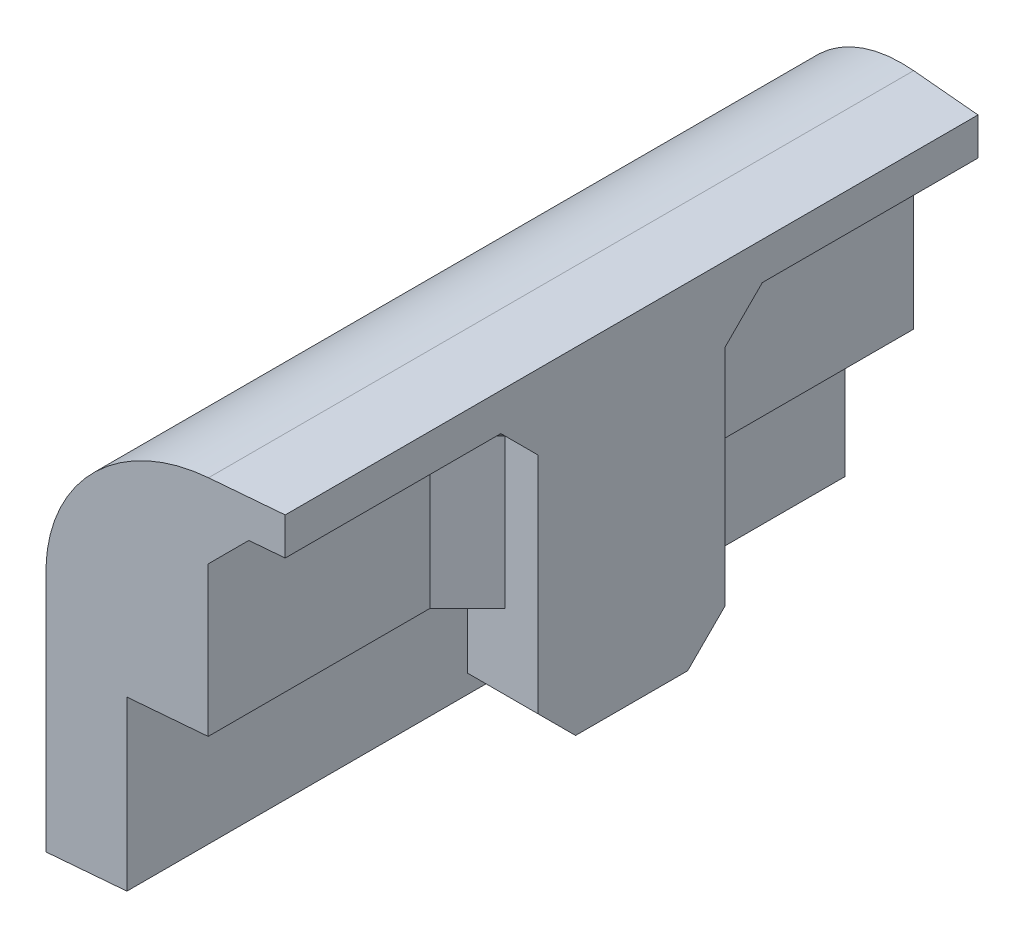
ISO-10303-21;
HEADER;
FILE_DESCRIPTION(('STEP AP214'),'2;1');
FILE_NAME('part.step','',(''),(''),'','','');
FILE_SCHEMA(('AUTOMOTIVE_DESIGN { 1 0 10303 214 1 1 1 1 }'));
ENDSEC;
DATA;
#1=APPLICATION_CONTEXT('core data for automotive mechanical design processes');
#2=APPLICATION_PROTOCOL_DEFINITION('international standard','automotive_design',2000,#1);
#3=PRODUCT_CONTEXT('',#1,'mechanical');
#4=PRODUCT('Part','Part','',(#3));
#5=PRODUCT_RELATED_PRODUCT_CATEGORY('part','',(#4));
#6=PRODUCT_DEFINITION_FORMATION('','',#4);
#7=PRODUCT_DEFINITION_CONTEXT('part definition',#1,'design');
#8=PRODUCT_DEFINITION('design','',#6,#7);
#9=PRODUCT_DEFINITION_SHAPE('','',#8);
#10=(LENGTH_UNIT() NAMED_UNIT(*) SI_UNIT(.MILLI.,.METRE.));
#11=(NAMED_UNIT(*) PLANE_ANGLE_UNIT() SI_UNIT($,.RADIAN.));
#12=(NAMED_UNIT(*) SI_UNIT($,.STERADIAN.) SOLID_ANGLE_UNIT());
#13=UNCERTAINTY_MEASURE_WITH_UNIT(LENGTH_MEASURE(1.E-05),#10,'distance_accuracy_value','');
#14=(GEOMETRIC_REPRESENTATION_CONTEXT(3) GLOBAL_UNCERTAINTY_ASSIGNED_CONTEXT((#13)) GLOBAL_UNIT_ASSIGNED_CONTEXT((#10,
#11,#12)) REPRESENTATION_CONTEXT('',''));
#15=CARTESIAN_POINT('',(0.,0.,0.));
#16=DIRECTION('',(0.,0.,1.));
#17=DIRECTION('',(1.,0.,0.));
#18=AXIS2_PLACEMENT_3D('',#15,#16,#17);
#19=CARTESIAN_POINT('',(-301.612263913905,87.8585951480168,-137.105018087838));
#20=DIRECTION('',(0.,-1.,0.));
#21=DIRECTION('',(0.,0.,-1.));
#22=AXIS2_PLACEMENT_3D('',#19,#20,#21);
#23=PLANE('',#22);
#24=DIRECTION('',(0.,0.,-1.));
#25=VECTOR('',#24,1.);
#26=CARTESIAN_POINT('',(-295.262263913905,87.8585951480168,15.875));
#27=LINE('',#26,#25);
#28=CARTESIAN_POINT('',(-295.262263913905,87.8585951480168,59.3791114816161));
#29=VERTEX_POINT('',#28);
#30=CARTESIAN_POINT('',(-295.262263913905,87.8585951480168,22.225));
#31=VERTEX_POINT('',#30);
#32=EDGE_CURVE('E283',#29,#31,#27,.T.);
#33=ORIENTED_EDGE('',*,*,#32,.T.);
#34=DIRECTION('',(1.,0.,0.));
#35=VECTOR('',#34,1.);
#36=CARTESIAN_POINT('',(-301.612263913905,87.8585951480168,22.225));
#37=LINE('',#36,#35);
#38=CARTESIAN_POINT('',(-289.576764759634,87.8585951480168,22.225));
#39=VERTEX_POINT('',#38);
#40=EDGE_CURVE('E285',#31,#39,#37,.T.);
#41=ORIENTED_EDGE('',*,*,#40,.T.);
#42=DIRECTION('',(0.,0.,1.));
#43=VECTOR('',#42,1.);
#44=CARTESIAN_POINT('',(-289.576764759634,87.8585951480168,-137.105018087838));
#45=LINE('',#44,#43);
#46=CARTESIAN_POINT('',(-289.576764759634,87.8585951480168,58.8816947591312));
#47=VERTEX_POINT('',#46);
#48=EDGE_CURVE('E242',#39,#47,#45,.T.);
#49=ORIENTED_EDGE('',*,*,#48,.T.);
#50=DIRECTION('',(-0.996194698091746,0.,0.0871557427476582));
#51=VECTOR('',#50,1.);
#52=CARTESIAN_POINT('',(-308.312509549559,87.8585951480168,60.5208600309645));
#53=LINE('',#52,#51);
#54=EDGE_CURVE('E234',#47,#29,#53,.T.);
#55=ORIENTED_EDGE('',*,*,#54,.T.);
#56=EDGE_LOOP('',(#33,#41,#49,#55));
#57=FACE_BOUND('',#56,.T.);
#58=ADVANCED_FACE('F35',(#57),#23,.T.);
#59=CARTESIAN_POINT('',(-289.576764759634,87.8585951480168,-58.8816947591312));
#60=VERTEX_POINT('',#59);
#61=CARTESIAN_POINT('',(-289.576764759634,87.8585951480168,-22.225));
#62=VERTEX_POINT('',#61);
#63=EDGE_CURVE('E238',#60,#62,#45,.T.);
#64=ORIENTED_EDGE('',*,*,#63,.T.);
#65=DIRECTION('',(-1.,0.,0.));
#66=VECTOR('',#65,1.);
#67=CARTESIAN_POINT('',(-301.612263913905,87.8585951480168,-22.225));
#68=LINE('',#67,#66);
#69=CARTESIAN_POINT('',(-295.262263913905,87.8585951480168,-22.225));
#70=VERTEX_POINT('',#69);
#71=EDGE_CURVE('E293',#62,#70,#68,.T.);
#72=ORIENTED_EDGE('',*,*,#71,.T.);
#73=DIRECTION('',(0.,0.,-1.));
#74=VECTOR('',#73,1.);
#75=CARTESIAN_POINT('',(-295.262263913905,87.8585951480168,-59.9346644950057));
#76=LINE('',#75,#74);
#77=CARTESIAN_POINT('',(-295.262263913905,87.8585951480168,-59.3791114816161));
#78=VERTEX_POINT('',#77);
#79=EDGE_CURVE('E291',#70,#78,#76,.T.);
#80=ORIENTED_EDGE('',*,*,#79,.T.);
#81=DIRECTION('',(-0.996194698091746,0.,-0.0871557427476582));
#82=VECTOR('',#81,1.);
#83=CARTESIAN_POINT('',(-308.312509549559,87.8585951480168,-60.5208600309645));
#84=LINE('',#83,#82);
#85=EDGE_CURVE('E270',#60,#78,#84,.T.);
#86=ORIENTED_EDGE('',*,*,#85,.F.);
#87=EDGE_LOOP('',(#64,#72,#80,#86));
#88=FACE_BOUND('',#87,.T.);
#89=ADVANCED_FACE('F355',(#88),#23,.T.);
#90=CARTESIAN_POINT('',(-301.612263913905,56.1085951480168,-137.105018087838));
#91=DIRECTION('',(1.,0.,0.));
#92=DIRECTION('',(0.,0.,-1.));
#93=AXIS2_PLACEMENT_3D('',#90,#91,#92);
#94=PLANE('',#93);
#95=DIRECTION('',(0.,1.,0.));
#96=VECTOR('',#95,1.);
#97=CARTESIAN_POINT('',(-301.612263913905,56.1085951480168,22.225));
#98=LINE('',#97,#96);
#99=CARTESIAN_POINT('',(-301.612263913905,56.1085951480168,22.225));
#100=VERTEX_POINT('',#99);
#101=CARTESIAN_POINT('',(-301.612263913905,81.5085951480168,22.225));
#102=VERTEX_POINT('',#101);
#103=EDGE_CURVE('E287',#100,#102,#98,.T.);
#104=ORIENTED_EDGE('',*,*,#103,.T.);
#105=DIRECTION('',(0.,0.,1.));
#106=VECTOR('',#105,1.);
#107=CARTESIAN_POINT('',(-301.612263913905,81.5085951480168,59.9346644950057));
#108=LINE('',#107,#106);
#109=CARTESIAN_POINT('',(-301.612263913905,81.5085951480168,59.9346644950057));
#110=VERTEX_POINT('',#109);
#111=EDGE_CURVE('E289',#102,#110,#108,.T.);
#112=ORIENTED_EDGE('',*,*,#111,.T.);
#113=DIRECTION('',(0.,-1.,0.));
#114=VECTOR('',#113,1.);
#115=CARTESIAN_POINT('',(-301.612263913905,56.1085951480168,59.9346644950057));
#116=LINE('',#115,#114);
#117=CARTESIAN_POINT('',(-301.612263913905,56.1085951480168,59.9346644950057));
#118=VERTEX_POINT('',#117);
#119=EDGE_CURVE('E232',#110,#118,#116,.T.);
#120=ORIENTED_EDGE('',*,*,#119,.T.);
#121=DIRECTION('',(0.,0.,1.));
#122=VECTOR('',#121,1.);
#123=CARTESIAN_POINT('',(-301.612263913905,56.1085951480168,-137.105018087838));
#124=LINE('',#123,#122);
#125=EDGE_CURVE('E247',#100,#118,#124,.T.);
#126=ORIENTED_EDGE('',*,*,#125,.F.);
#127=EDGE_LOOP('',(#104,#112,#120,#126));
#128=FACE_BOUND('',#127,.T.);
#129=ADVANCED_FACE('F408',(#128),#94,.T.);
#130=DIRECTION('',(0.,0.,1.));
#131=VECTOR('',#130,1.);
#132=CARTESIAN_POINT('',(-301.612263913905,81.5085951480167,-15.875));
#133=LINE('',#132,#131);
#134=CARTESIAN_POINT('',(-301.612263913905,81.5085951480167,-59.9346644950057));
#135=VERTEX_POINT('',#134);
#136=CARTESIAN_POINT('',(-301.612263913905,81.5085951480167,-22.2250000000001));
#137=VERTEX_POINT('',#136);
#138=EDGE_CURVE('E304',#135,#137,#133,.T.);
#139=ORIENTED_EDGE('',*,*,#138,.T.);
#140=DIRECTION('',(0.,-1.,0.));
#141=VECTOR('',#140,1.);
#142=CARTESIAN_POINT('',(-301.612263913905,56.1085951480168,-22.2250000000001));
#143=LINE('',#142,#141);
#144=CARTESIAN_POINT('',(-301.612263913905,56.1085951480168,-22.2250000000001));
#145=VERTEX_POINT('',#144);
#146=EDGE_CURVE('E306',#137,#145,#143,.T.);
#147=ORIENTED_EDGE('',*,*,#146,.T.);
#148=CARTESIAN_POINT('',(-301.612263913905,56.1085951480168,-59.9346644950057));
#149=VERTEX_POINT('',#148);
#150=EDGE_CURVE('E243',#149,#145,#124,.T.);
#151=ORIENTED_EDGE('',*,*,#150,.F.);
#152=DIRECTION('',(0.,-1.,0.));
#153=VECTOR('',#152,1.);
#154=CARTESIAN_POINT('',(-301.612263913905,56.1085951480168,-59.9346644950057));
#155=LINE('',#154,#153);
#156=EDGE_CURVE('E268',#135,#149,#155,.T.);
#157=ORIENTED_EDGE('',*,*,#156,.F.);
#158=EDGE_LOOP('',(#139,#147,#151,#157));
#159=FACE_BOUND('',#158,.T.);
#160=ADVANCED_FACE('F415',(#159),#94,.T.);
#161=CARTESIAN_POINT('',(-289.576764759634,87.8585951480168,-137.105018087838));
#162=DIRECTION('',(1.,0.,0.));
#163=DIRECTION('',(0.,0.,-1.));
#164=AXIS2_PLACEMENT_3D('',#161,#162,#163);
#165=PLANE('',#164);
#166=DIRECTION('',(0.,0.,-1.));
#167=VECTOR('',#166,1.);
#168=CARTESIAN_POINT('',(-289.576764759634,37.058595148016,-15.875));
#169=LINE('',#168,#167);
#170=CARTESIAN_POINT('',(-289.576764759634,37.058595148016,9.525));
#171=VERTEX_POINT('',#170);
#172=CARTESIAN_POINT('',(-289.576764759634,37.058595148016,-9.52499999999995));
#173=VERTEX_POINT('',#172);
#174=EDGE_CURVE('E220',#171,#173,#169,.T.);
#175=ORIENTED_EDGE('',*,*,#174,.T.);
#176=DIRECTION('',(0.,-0.707106781186546,0.707106781186549));
#177=VECTOR('',#176,1.);
#178=CARTESIAN_POINT('',(-289.576764759634,126.248604191935,-98.7150090439198));
#179=LINE('',#178,#177);
#180=CARTESIAN_POINT('',(-289.576764759634,43.408595148016,-15.875));
#181=VERTEX_POINT('',#180);
#182=EDGE_CURVE('E318',#173,#181,#179,.F.);
#183=ORIENTED_EDGE('',*,*,#182,.T.);
#184=DIRECTION('',(0.,1.,0.));
#185=VECTOR('',#184,1.);
#186=CARTESIAN_POINT('',(-289.576764759634,37.058595148016,-15.875));
#187=LINE('',#186,#185);
#188=CARTESIAN_POINT('',(-289.576764759634,81.5085951480167,-15.875));
#189=VERTEX_POINT('',#188);
#190=EDGE_CURVE('E215',#181,#189,#187,.T.);
#191=ORIENTED_EDGE('',*,*,#190,.T.);
#192=DIRECTION('',(0.,0.707106781186551,-0.707106781186544));
#193=VECTOR('',#192,1.);
#194=CARTESIAN_POINT('',(-289.576764759634,87.8585951480168,-22.225));
#195=LINE('',#194,#193);
#196=EDGE_CURVE('E326',#189,#62,#195,.T.);
#197=ORIENTED_EDGE('',*,*,#196,.T.);
#198=ORIENTED_EDGE('',*,*,#63,.F.);
#199=DIRECTION('',(0.,-1.,0.));
#200=VECTOR('',#199,1.);
#201=CARTESIAN_POINT('',(-289.576764759634,87.8585951480168,-58.8816947591312));
#202=LINE('',#201,#200);
#203=CARTESIAN_POINT('',(-289.576764759634,94.2085951480168,-58.8816947591312));
#204=VERTEX_POINT('',#203);
#205=EDGE_CURVE('E258',#204,#60,#202,.T.);
#206=ORIENTED_EDGE('',*,*,#205,.F.);
#207=DIRECTION('',(0.,0.,1.));
#208=VECTOR('',#207,1.);
#209=CARTESIAN_POINT('',(-289.576764759634,94.2085951480168,-137.105018087838));
#210=LINE('',#209,#208);
#211=CARTESIAN_POINT('',(-289.576764759634,94.2085951480168,58.8816947591312));
#212=VERTEX_POINT('',#211);
#213=EDGE_CURVE('E200',#204,#212,#210,.T.);
#214=ORIENTED_EDGE('',*,*,#213,.T.);
#215=DIRECTION('',(0.,-1.,0.));
#216=VECTOR('',#215,1.);
#217=CARTESIAN_POINT('',(-289.576764759634,87.8585951480168,58.8816947591312));
#218=LINE('',#217,#216);
#219=EDGE_CURVE('E210',#212,#47,#218,.T.);
#220=ORIENTED_EDGE('',*,*,#219,.T.);
#221=ORIENTED_EDGE('',*,*,#48,.F.);
#222=DIRECTION('',(0.,-0.707106781186549,-0.707106781186546));
#223=VECTOR('',#222,1.);
#224=CARTESIAN_POINT('',(-289.576764759634,81.5085951480168,15.875));
#225=LINE('',#224,#223);
#226=CARTESIAN_POINT('',(-289.576764759634,81.5085951480168,15.875));
#227=VERTEX_POINT('',#226);
#228=EDGE_CURVE('E320',#39,#227,#225,.T.);
#229=ORIENTED_EDGE('',*,*,#228,.T.);
#230=DIRECTION('',(0.,-1.,0.));
#231=VECTOR('',#230,1.);
#232=CARTESIAN_POINT('',(-289.576764759634,37.058595148016,15.875));
#233=LINE('',#232,#231);
#234=CARTESIAN_POINT('',(-289.576764759634,43.408595148016,15.875));
#235=VERTEX_POINT('',#234);
#236=EDGE_CURVE('E378',#227,#235,#233,.T.);
#237=ORIENTED_EDGE('',*,*,#236,.T.);
#238=DIRECTION('',(0.,0.707106781186549,0.707106781186546));
#239=VECTOR('',#238,1.);
#240=CARTESIAN_POINT('',(-289.576764759634,-10.8564138959027,-38.3900090439184));
#241=LINE('',#240,#239);
#242=EDGE_CURVE('E316',#235,#171,#241,.F.);
#243=ORIENTED_EDGE('',*,*,#242,.T.);
#244=EDGE_LOOP('',(#175,#183,#191,#197,#198,#206,#214,#220,#221,#229,#237,#243));
#245=FACE_BOUND('',#244,.T.);
#246=ADVANCED_FACE('F367',(#245),#165,.T.);
#247=CARTESIAN_POINT('',(-314.312263913905,56.1085951480168,-137.105018087838));
#248=DIRECTION('',(0.,-1.,0.));
#249=DIRECTION('',(1.,0.,0.));
#250=AXIS2_PLACEMENT_3D('',#247,#248,#249);
#251=PLANE('',#250);
#252=DIRECTION('',(-0.996194698091746,0.,-0.0871557427476582));
#253=VECTOR('',#252,1.);
#254=CARTESIAN_POINT('',(-320.916038781187,56.1085951480168,-61.6235259591495));
#255=LINE('',#254,#253);
#256=CARTESIAN_POINT('',(-314.312263913905,56.1085951480168,-61.045770521785));
#257=VERTEX_POINT('',#256);
#258=EDGE_CURVE('E266',#149,#257,#255,.T.);
#259=ORIENTED_EDGE('',*,*,#258,.F.);
#260=ORIENTED_EDGE('',*,*,#150,.T.);
#261=DIRECTION('',(0.707106781186545,0.,0.70710678118655));
#262=VECTOR('',#261,1.);
#263=CARTESIAN_POINT('',(-295.262263913905,56.1085951480168,-15.875));
#264=LINE('',#263,#262);
#265=CARTESIAN_POINT('',(-295.262263913905,56.1085951480168,-15.875));
#266=VERTEX_POINT('',#265);
#267=EDGE_CURVE('E44',#145,#266,#264,.T.);
#268=ORIENTED_EDGE('',*,*,#267,.T.);
#269=DIRECTION('',(1.,0.,0.));
#270=VECTOR('',#269,1.);
#271=CARTESIAN_POINT('',(-229.670984571074,56.1085951480169,-15.875));
#272=LINE('',#271,#270);
#273=CARTESIAN_POINT('',(-301.612263913905,56.1085951480168,-15.875));
#274=VERTEX_POINT('',#273);
#275=EDGE_CURVE('E52',#274,#266,#272,.T.);
#276=ORIENTED_EDGE('',*,*,#275,.F.);
#277=CARTESIAN_POINT('',(-301.612263913905,56.1085951480168,15.875));
#278=VERTEX_POINT('',#277);
#279=EDGE_CURVE('E246',#274,#278,#124,.T.);
#280=ORIENTED_EDGE('',*,*,#279,.T.);
#281=DIRECTION('',(-1.,0.,0.));
#282=VECTOR('',#281,1.);
#283=CARTESIAN_POINT('',(-229.670984571074,56.1085951480169,15.875));
#284=LINE('',#283,#282);
#285=CARTESIAN_POINT('',(-295.262263913905,56.1085951480168,15.875));
#286=VERTEX_POINT('',#285);
#287=EDGE_CURVE('E275',#286,#278,#284,.T.);
#288=ORIENTED_EDGE('',*,*,#287,.F.);
#289=DIRECTION('',(-0.707106781186549,0.,0.707106781186546));
#290=VECTOR('',#289,1.);
#291=CARTESIAN_POINT('',(-295.262263913905,56.1085951480168,15.875));
#292=LINE('',#291,#290);
#293=EDGE_CURVE('E324',#286,#100,#292,.T.);
#294=ORIENTED_EDGE('',*,*,#293,.T.);
#295=ORIENTED_EDGE('',*,*,#125,.T.);
#296=DIRECTION('',(-0.996194698091746,0.,0.0871557427476582));
#297=VECTOR('',#296,1.);
#298=CARTESIAN_POINT('',(-320.916038781187,56.1085951480168,61.6235259591495));
#299=LINE('',#298,#297);
#300=CARTESIAN_POINT('',(-314.312263913905,56.1085951480168,61.045770521785));
#301=VERTEX_POINT('',#300);
#302=EDGE_CURVE('E229',#118,#301,#299,.T.);
#303=ORIENTED_EDGE('',*,*,#302,.T.);
#304=DIRECTION('',(0.,0.,1.));
#305=VECTOR('',#304,1.);
#306=CARTESIAN_POINT('',(-314.312263913905,56.1085951480168,-137.105018087838));
#307=LINE('',#306,#305);
#308=EDGE_CURVE('E248',#257,#301,#307,.T.);
#309=ORIENTED_EDGE('',*,*,#308,.F.);
#310=EDGE_LOOP('',(#259,#260,#268,#276,#280,#288,#294,#295,#303,#309));
#311=FACE_BOUND('',#310,.T.);
#312=ADVANCED_FACE('F417',(#311),#251,.T.);
#313=CARTESIAN_POINT('',(-314.312263913905,27.5335951480168,-137.105018087838));
#314=DIRECTION('',(1.,0.,0.));
#315=DIRECTION('',(0.,1.,0.));
#316=AXIS2_PLACEMENT_3D('',#313,#314,#315);
#317=PLANE('',#316);
#318=DIRECTION('',(0.,-1.,0.));
#319=VECTOR('',#318,1.);
#320=CARTESIAN_POINT('',(-314.312263913905,27.5335951480168,-61.0457705217849));
#321=LINE('',#320,#319);
#322=CARTESIAN_POINT('',(-314.312263913905,27.5335951480168,-61.045770521785));
#323=VERTEX_POINT('',#322);
#324=EDGE_CURVE('E264',#257,#323,#321,.T.);
#325=ORIENTED_EDGE('',*,*,#324,.F.);
#326=ORIENTED_EDGE('',*,*,#308,.T.);
#327=DIRECTION('',(0.,-1.,0.));
#328=VECTOR('',#327,1.);
#329=CARTESIAN_POINT('',(-314.312263913905,27.5335951480168,61.0457705217849));
#330=LINE('',#329,#328);
#331=CARTESIAN_POINT('',(-314.312263913905,27.5335951480168,61.045770521785));
#332=VERTEX_POINT('',#331);
#333=EDGE_CURVE('E226',#301,#332,#330,.T.);
#334=ORIENTED_EDGE('',*,*,#333,.T.);
#335=DIRECTION('',(0.,0.,1.));
#336=VECTOR('',#335,1.);
#337=CARTESIAN_POINT('',(-314.312263913905,27.5335951480168,-137.105018087838));
#338=LINE('',#337,#336);
#339=EDGE_CURVE('E250',#323,#332,#338,.T.);
#340=ORIENTED_EDGE('',*,*,#339,.F.);
#341=EDGE_LOOP('',(#325,#326,#334,#340));
#342=FACE_BOUND('',#341,.T.);
#343=ADVANCED_FACE('F420',(#342),#317,.T.);
#344=CARTESIAN_POINT('',(-326.96393657967,27.5335951480168,-137.105018087838));
#345=DIRECTION('',(0.,-1.,0.));
#346=DIRECTION('',(1.,0.,0.));
#347=AXIS2_PLACEMENT_3D('',#344,#345,#346);
#348=PLANE('',#347);
#349=DIRECTION('',(-0.996194698091746,0.,-0.0871557427476582));
#350=VECTOR('',#349,1.);
#351=CARTESIAN_POINT('',(-333.471607778978,27.5335951480168,-62.7219959105738));
#352=LINE('',#351,#350);
#353=CARTESIAN_POINT('',(-326.96393657967,27.5335951480168,-62.1526484546802));
#354=VERTEX_POINT('',#353);
#355=EDGE_CURVE('E262',#323,#354,#352,.T.);
#356=ORIENTED_EDGE('',*,*,#355,.F.);
#357=ORIENTED_EDGE('',*,*,#339,.T.);
#358=DIRECTION('',(-0.996194698091746,0.,0.0871557427476582));
#359=VECTOR('',#358,1.);
#360=CARTESIAN_POINT('',(-333.471607778978,27.5335951480168,62.7219959105738));
#361=LINE('',#360,#359);
#362=CARTESIAN_POINT('',(-326.96393657967,27.5335951480168,62.1526484546802));
#363=VERTEX_POINT('',#362);
#364=EDGE_CURVE('E217',#332,#363,#361,.T.);
#365=ORIENTED_EDGE('',*,*,#364,.T.);
#366=DIRECTION('',(0.,0.,1.));
#367=VECTOR('',#366,1.);
#368=CARTESIAN_POINT('',(-326.96393657967,27.5335951480168,-137.105018087838));
#369=LINE('',#368,#367);
#370=EDGE_CURVE('E252',#354,#363,#369,.T.);
#371=ORIENTED_EDGE('',*,*,#370,.F.);
#372=EDGE_LOOP('',(#356,#357,#365,#371));
#373=FACE_BOUND('',#372,.T.);
#374=ADVANCED_FACE('F423',(#373),#348,.T.);
#375=CARTESIAN_POINT('',(-326.96393657967,68.8085951480168,-137.105018087838));
#376=DIRECTION('',(-1.,0.,0.));
#377=DIRECTION('',(0.,0.,1.));
#378=AXIS2_PLACEMENT_3D('',#375,#376,#377);
#379=PLANE('',#378);
#380=DIRECTION('',(0.,1.,0.));
#381=VECTOR('',#380,1.);
#382=CARTESIAN_POINT('',(-326.96393657967,68.8085951480168,-62.1526484546802));
#383=LINE('',#382,#381);
#384=CARTESIAN_POINT('',(-326.96393657967,68.8085951480168,-62.1526484546802));
#385=VERTEX_POINT('',#384);
#386=EDGE_CURVE('E260',#354,#385,#383,.T.);
#387=ORIENTED_EDGE('',*,*,#386,.F.);
#388=ORIENTED_EDGE('',*,*,#370,.T.);
#389=DIRECTION('',(0.,1.,0.));
#390=VECTOR('',#389,1.);
#391=CARTESIAN_POINT('',(-326.96393657967,68.8085951480168,62.1526484546802));
#392=LINE('',#391,#390);
#393=CARTESIAN_POINT('',(-326.96393657967,68.8085951480168,62.1526484546802));
#394=VERTEX_POINT('',#393);
#395=EDGE_CURVE('E214',#363,#394,#392,.T.);
#396=ORIENTED_EDGE('',*,*,#395,.T.);
#397=DIRECTION('',(0.,0.,1.));
#398=VECTOR('',#397,1.);
#399=CARTESIAN_POINT('',(-326.96393657967,68.8085951480168,-137.105018087838));
#400=LINE('',#399,#398);
#401=EDGE_CURVE('E199',#385,#394,#400,.T.);
#402=ORIENTED_EDGE('',*,*,#401,.F.);
#403=EDGE_LOOP('',(#387,#388,#396,#402));
#404=FACE_BOUND('',#403,.T.);
#405=ADVANCED_FACE('F427',(#404),#379,.T.);
#406=CARTESIAN_POINT('',(-301.56393657967,68.8085951480168,-137.105018087838));
#407=DIRECTION('',(0.,0.,1.));
#408=DIRECTION('',(1.,0.,0.));
#409=AXIS2_PLACEMENT_3D('',#406,#407,#408);
#410=CYLINDRICAL_SURFACE('',#409,25.4);
#411=CARTESIAN_POINT('',(-301.56393657967,68.8085951480168,-59.9304364011218));
#412=DIRECTION('',(-0.0871557427476582,0.,0.996194698091746));
#413=DIRECTION('',(0.996194698091746,0.,0.0871557427476582));
#414=AXIS2_PLACEMENT_3D('',#411,#412,#413);
#415=ELLIPSE('',#414,25.497023873601,25.4);
#416=CARTESIAN_POINT('',(-301.56393657967,94.2085951480168,-59.9304364011218));
#417=VERTEX_POINT('',#416);
#418=EDGE_CURVE('E241',#385,#417,#415,.F.);
#419=ORIENTED_EDGE('',*,*,#418,.F.);
#420=ORIENTED_EDGE('',*,*,#401,.T.);
#421=CARTESIAN_POINT('',(-301.56393657967,68.8085951480168,59.9304364011218));
#422=DIRECTION('',(0.0871557427476582,0.,0.996194698091746));
#423=DIRECTION('',(0.996194698091746,0.,-0.0871557427476582));
#424=AXIS2_PLACEMENT_3D('',#421,#422,#423);
#425=ELLIPSE('',#424,25.497023873601,25.4);
#426=CARTESIAN_POINT('',(-301.56393657967,94.2085951480168,59.9304364011218));
#427=VERTEX_POINT('',#426);
#428=EDGE_CURVE('E206',#394,#427,#425,.F.);
#429=ORIENTED_EDGE('',*,*,#428,.T.);
#430=DIRECTION('',(0.,0.,1.));
#431=VECTOR('',#430,1.);
#432=CARTESIAN_POINT('',(-301.56393657967,94.2085951480168,-137.105018087838));
#433=LINE('',#432,#431);
#434=EDGE_CURVE('E189',#417,#427,#433,.T.);
#435=ORIENTED_EDGE('',*,*,#434,.F.);
#436=EDGE_LOOP('',(#419,#420,#429,#435));
#437=FACE_BOUND('',#436,.T.);
#438=ADVANCED_FACE('F212',(#437),#410,.T.);
#439=CARTESIAN_POINT('',(-289.576764759634,94.2085951480168,-137.105018087838));
#440=DIRECTION('',(0.,1.,0.));
#441=DIRECTION('',(0.,0.,1.));
#442=AXIS2_PLACEMENT_3D('',#439,#440,#441);
#443=PLANE('',#442);
#444=DIRECTION('',(0.996194698091746,0.,0.0871557427476582));
#445=VECTOR('',#444,1.);
#446=CARTESIAN_POINT('',(-296.368433533175,94.2085951480168,-59.475888783239));
#447=LINE('',#446,#445);
#448=EDGE_CURVE('E195',#417,#204,#447,.T.);
#449=ORIENTED_EDGE('',*,*,#448,.F.);
#450=ORIENTED_EDGE('',*,*,#434,.T.);
#451=DIRECTION('',(0.996194698091746,0.,-0.0871557427476582));
#452=VECTOR('',#451,1.);
#453=CARTESIAN_POINT('',(-296.368433533175,94.2085951480168,59.475888783239));
#454=LINE('',#453,#452);
#455=EDGE_CURVE('E193',#427,#212,#454,.T.);
#456=ORIENTED_EDGE('',*,*,#455,.T.);
#457=ORIENTED_EDGE('',*,*,#213,.F.);
#458=EDGE_LOOP('',(#449,#450,#456,#457));
#459=FACE_BOUND('',#458,.T.);
#460=ADVANCED_FACE('F191',(#459),#443,.T.);
#461=CARTESIAN_POINT('',(1.97977752003004,2.13359514801679,-33.3738025328438));
#462=DIRECTION('',(-0.0871557427476582,0.,0.996194698091746));
#463=DIRECTION('',(0.996194698091746,0.,0.0871557427476582));
#464=AXIS2_PLACEMENT_3D('',#461,#462,#463);
#465=PLANE('',#464);
#466=ORIENTED_EDGE('',*,*,#448,.T.);
#467=ORIENTED_EDGE('',*,*,#205,.T.);
#468=ORIENTED_EDGE('',*,*,#85,.T.);
#469=DIRECTION('',(0.705757556807949,0.705757556807955,0.0617457854184489));
#470=VECTOR('',#469,1.);
#471=CARTESIAN_POINT('',(-188.773704228654,194.347154833269,-50.0625697139529));
#472=LINE('',#471,#470);
#473=EDGE_CURVE('E11',#78,#135,#472,.F.);
#474=ORIENTED_EDGE('',*,*,#473,.T.);
#475=ORIENTED_EDGE('',*,*,#156,.T.);
#476=ORIENTED_EDGE('',*,*,#258,.T.);
#477=ORIENTED_EDGE('',*,*,#324,.T.);
#478=ORIENTED_EDGE('',*,*,#355,.T.);
#479=ORIENTED_EDGE('',*,*,#386,.T.);
#480=ORIENTED_EDGE('',*,*,#418,.T.);
#481=EDGE_LOOP('',(#466,#467,#468,#474,#475,#476,#477,#478,#479,#480));
#482=FACE_BOUND('',#481,.T.);
#483=ADVANCED_FACE('F411',(#482),#465,.F.);
#484=CARTESIAN_POINT('',(1.97977752003004,2.13359514801679,33.3738025328438));
#485=DIRECTION('',(-0.0871557427476582,0.,-0.996194698091746));
#486=DIRECTION('',(0.996194698091746,0.,-0.0871557427476582));
#487=AXIS2_PLACEMENT_3D('',#484,#485,#486);
#488=PLANE('',#487);
#489=ORIENTED_EDGE('',*,*,#455,.F.);
#490=ORIENTED_EDGE('',*,*,#428,.F.);
#491=ORIENTED_EDGE('',*,*,#395,.F.);
#492=ORIENTED_EDGE('',*,*,#364,.F.);
#493=ORIENTED_EDGE('',*,*,#333,.F.);
#494=ORIENTED_EDGE('',*,*,#302,.F.);
#495=ORIENTED_EDGE('',*,*,#119,.F.);
#496=DIRECTION('',(-0.705757556807953,-0.705757556807951,0.0617457854184492));
#497=VECTOR('',#496,1.);
#498=CARTESIAN_POINT('',(-188.773704228652,194.34715483327,50.0625697139527));
#499=LINE('',#498,#497);
#500=EDGE_CURVE('E322',#110,#29,#499,.F.);
#501=ORIENTED_EDGE('',*,*,#500,.T.);
#502=ORIENTED_EDGE('',*,*,#54,.F.);
#503=ORIENTED_EDGE('',*,*,#219,.F.);
#504=EDGE_LOOP('',(#489,#490,#491,#492,#493,#494,#495,#501,#502,#503));
#505=FACE_BOUND('',#504,.T.);
#506=ADVANCED_FACE('F204',(#505),#488,.F.);
#507=CARTESIAN_POINT('',(-229.670984571074,37.058595148016,15.875));
#508=DIRECTION('',(0.,0.,-1.));
#509=DIRECTION('',(-1.,0.,0.));
#510=AXIS2_PLACEMENT_3D('',#507,#508,#509);
#511=PLANE('',#510);
#512=ORIENTED_EDGE('',*,*,#236,.F.);
#513=DIRECTION('',(-1.,0.,0.));
#514=VECTOR('',#513,1.);
#515=CARTESIAN_POINT('',(-229.670984571074,81.5085951480168,15.875));
#516=LINE('',#515,#514);
#517=CARTESIAN_POINT('',(-295.262263913905,81.5085951480168,15.875));
#518=VERTEX_POINT('',#517);
#519=EDGE_CURVE('E280',#227,#518,#516,.T.);
#520=ORIENTED_EDGE('',*,*,#519,.T.);
#521=DIRECTION('',(0.,-1.,0.));
#522=VECTOR('',#521,1.);
#523=CARTESIAN_POINT('',(-295.262263913905,37.058595148016,15.875));
#524=LINE('',#523,#522);
#525=EDGE_CURVE('E277',#518,#286,#524,.T.);
#526=ORIENTED_EDGE('',*,*,#525,.T.);
#527=ORIENTED_EDGE('',*,*,#287,.T.);
#528=DIRECTION('',(0.,-1.,0.));
#529=VECTOR('',#528,1.);
#530=CARTESIAN_POINT('',(-301.612263913905,37.058595148016,15.875));
#531=LINE('',#530,#529);
#532=CARTESIAN_POINT('',(-301.612263913905,43.408595148016,15.875));
#533=VERTEX_POINT('',#532);
#534=EDGE_CURVE('E337',#278,#533,#531,.T.);
#535=ORIENTED_EDGE('',*,*,#534,.T.);
#536=DIRECTION('',(1.,0.,0.));
#537=VECTOR('',#536,1.);
#538=CARTESIAN_POINT('',(-229.670984571074,43.408595148016,15.875));
#539=LINE('',#538,#537);
#540=EDGE_CURVE('E257',#533,#235,#539,.T.);
#541=ORIENTED_EDGE('',*,*,#540,.T.);
#542=EDGE_LOOP('',(#512,#520,#526,#527,#535,#541));
#543=FACE_BOUND('',#542,.T.);
#544=ADVANCED_FACE('F389',(#543),#511,.F.);
#545=CARTESIAN_POINT('',(-229.670984571074,37.058595148016,-15.875));
#546=DIRECTION('',(0.,1.,0.));
#547=DIRECTION('',(0.,0.,1.));
#548=AXIS2_PLACEMENT_3D('',#545,#546,#547);
#549=PLANE('',#548);
#550=DIRECTION('',(0.,0.,-1.));
#551=VECTOR('',#550,1.);
#552=CARTESIAN_POINT('',(-301.612263913905,37.058595148016,-15.875));
#553=LINE('',#552,#551);
#554=CARTESIAN_POINT('',(-301.612263913905,37.058595148016,9.525));
#555=VERTEX_POINT('',#554);
#556=CARTESIAN_POINT('',(-301.612263913905,37.058595148016,-9.52499999999995));
#557=VERTEX_POINT('',#556);
#558=EDGE_CURVE('E379',#555,#557,#553,.T.);
#559=ORIENTED_EDGE('',*,*,#558,.T.);
#560=DIRECTION('',(1.,0.,0.));
#561=VECTOR('',#560,1.);
#562=CARTESIAN_POINT('',(-229.670984571074,37.058595148016,-9.52499999999995));
#563=LINE('',#562,#561);
#564=EDGE_CURVE('E60',#557,#173,#563,.T.);
#565=ORIENTED_EDGE('',*,*,#564,.T.);
#566=ORIENTED_EDGE('',*,*,#174,.F.);
#567=DIRECTION('',(-1.,0.,0.));
#568=VECTOR('',#567,1.);
#569=CARTESIAN_POINT('',(-229.670984571074,37.058595148016,9.525));
#570=LINE('',#569,#568);
#571=EDGE_CURVE('E312',#171,#555,#570,.T.);
#572=ORIENTED_EDGE('',*,*,#571,.T.);
#573=EDGE_LOOP('',(#559,#565,#566,#572));
#574=FACE_BOUND('',#573,.T.);
#575=ADVANCED_FACE('F393',(#574),#549,.F.);
#576=CARTESIAN_POINT('',(-229.670984571074,37.058595148016,-15.875));
#577=DIRECTION('',(0.,0.,1.));
#578=DIRECTION('',(1.,0.,0.));
#579=AXIS2_PLACEMENT_3D('',#576,#577,#578);
#580=PLANE('',#579);
#581=DIRECTION('',(0.,1.,0.));
#582=VECTOR('',#581,1.);
#583=CARTESIAN_POINT('',(-295.262263913905,37.058595148016,-15.875));
#584=LINE('',#583,#582);
#585=CARTESIAN_POINT('',(-295.262263913905,81.5085951480167,-15.875));
#586=VERTEX_POINT('',#585);
#587=EDGE_CURVE('E300',#266,#586,#584,.T.);
#588=ORIENTED_EDGE('',*,*,#587,.T.);
#589=DIRECTION('',(1.,0.,0.));
#590=VECTOR('',#589,1.);
#591=CARTESIAN_POINT('',(-229.670984571074,81.5085951480167,-15.875));
#592=LINE('',#591,#590);
#593=EDGE_CURVE('E302',#586,#189,#592,.T.);
#594=ORIENTED_EDGE('',*,*,#593,.T.);
#595=ORIENTED_EDGE('',*,*,#190,.F.);
#596=DIRECTION('',(-1.,0.,0.));
#597=VECTOR('',#596,1.);
#598=CARTESIAN_POINT('',(-229.670984571074,43.408595148016,-15.875));
#599=LINE('',#598,#597);
#600=CARTESIAN_POINT('',(-301.612263913905,43.408595148016,-15.875));
#601=VERTEX_POINT('',#600);
#602=EDGE_CURVE('E296',#181,#601,#599,.T.);
#603=ORIENTED_EDGE('',*,*,#602,.T.);
#604=DIRECTION('',(0.,1.,0.));
#605=VECTOR('',#604,1.);
#606=CARTESIAN_POINT('',(-301.612263913905,37.058595148016,-15.875));
#607=LINE('',#606,#605);
#608=EDGE_CURVE('E372',#601,#274,#607,.T.);
#609=ORIENTED_EDGE('',*,*,#608,.T.);
#610=ORIENTED_EDGE('',*,*,#275,.T.);
#611=EDGE_LOOP('',(#588,#594,#595,#603,#609,#610));
#612=FACE_BOUND('',#611,.T.);
#613=ADVANCED_FACE('F363',(#612),#580,.F.);
#614=CARTESIAN_POINT('',(-301.612263913905,0.,0.));
#615=DIRECTION('',(1.,0.,0.));
#616=DIRECTION('',(0.,0.,-1.));
#617=AXIS2_PLACEMENT_3D('',#614,#615,#616);
#618=PLANE('',#617);
#619=ORIENTED_EDGE('',*,*,#608,.F.);
#620=DIRECTION('',(0.,0.707106781186546,-0.707106781186549));
#621=VECTOR('',#620,1.);
#622=CARTESIAN_POINT('',(-301.612263913905,43.408595148016,-15.875));
#623=LINE('',#622,#621);
#624=EDGE_CURVE('E310',#601,#557,#623,.F.);
#625=ORIENTED_EDGE('',*,*,#624,.T.);
#626=ORIENTED_EDGE('',*,*,#558,.F.);
#627=DIRECTION('',(0.,-0.707106781186549,-0.707106781186546));
#628=VECTOR('',#627,1.);
#629=CARTESIAN_POINT('',(-301.612263913905,37.058595148016,9.525));
#630=LINE('',#629,#628);
#631=EDGE_CURVE('E308',#555,#533,#630,.F.);
#632=ORIENTED_EDGE('',*,*,#631,.T.);
#633=ORIENTED_EDGE('',*,*,#534,.F.);
#634=ORIENTED_EDGE('',*,*,#279,.F.);
#635=EDGE_LOOP('',(#619,#625,#626,#632,#633,#634));
#636=FACE_BOUND('',#635,.T.);
#637=ADVANCED_FACE('F375',(#636),#618,.F.);
#638=CARTESIAN_POINT('',(-295.262263913905,37.058595148016,15.875));
#639=DIRECTION('',(-0.707106781186546,0.,-0.707106781186549));
#640=DIRECTION('',(0.,-1.,0.));
#641=AXIS2_PLACEMENT_3D('',#638,#639,#640);
#642=PLANE('',#641);
#643=ORIENTED_EDGE('',*,*,#293,.F.);
#644=ORIENTED_EDGE('',*,*,#525,.F.);
#645=DIRECTION('',(0.707106781186549,0.,-0.707106781186546));
#646=VECTOR('',#645,1.);
#647=CARTESIAN_POINT('',(-295.262263913905,81.5085951480168,15.875));
#648=LINE('',#647,#646);
#649=EDGE_CURVE('E334',#102,#518,#648,.T.);
#650=ORIENTED_EDGE('',*,*,#649,.F.);
#651=ORIENTED_EDGE('',*,*,#103,.F.);
#652=EDGE_LOOP('',(#643,#644,#650,#651));
#653=FACE_BOUND('',#652,.T.);
#654=ADVANCED_FACE('F449',(#653),#642,.F.);
#655=CARTESIAN_POINT('',(-301.612263913905,81.5085951480168,-137.105018087838));
#656=DIRECTION('',(0.707106781186547,-0.707106781186548,0.));
#657=DIRECTION('',(0.,0.,-1.));
#658=AXIS2_PLACEMENT_3D('',#655,#656,#657);
#659=PLANE('',#658);
#660=ORIENTED_EDGE('',*,*,#500,.F.);
#661=ORIENTED_EDGE('',*,*,#111,.F.);
#662=DIRECTION('',(0.707106781186548,0.707106781186547,0.));
#663=VECTOR('',#662,1.);
#664=CARTESIAN_POINT('',(-298.437263913905,84.6835951480168,22.225));
#665=LINE('',#664,#663);
#666=EDGE_CURVE('E331',#31,#102,#665,.F.);
#667=ORIENTED_EDGE('',*,*,#666,.F.);
#668=ORIENTED_EDGE('',*,*,#32,.F.);
#669=EDGE_LOOP('',(#660,#661,#667,#668));
#670=FACE_BOUND('',#669,.T.);
#671=ADVANCED_FACE('F445',(#670),#659,.T.);
#672=CARTESIAN_POINT('',(-295.262263913905,81.5085951480168,15.875));
#673=DIRECTION('',(0.577350269189624,-0.577350269189625,0.577350269189628));
#674=DIRECTION('',(0.,-0.707106781186549,-0.707106781186546));
#675=AXIS2_PLACEMENT_3D('',#672,#673,#674);
#676=PLANE('',#675);
#677=ORIENTED_EDGE('',*,*,#666,.T.);
#678=ORIENTED_EDGE('',*,*,#649,.T.);
#679=DIRECTION('',(0.,0.707106781186549,0.707106781186546));
#680=VECTOR('',#679,1.);
#681=CARTESIAN_POINT('',(-295.262263913905,81.5085951480168,15.875));
#682=LINE('',#681,#680);
#683=EDGE_CURVE('E329',#31,#518,#682,.F.);
#684=ORIENTED_EDGE('',*,*,#683,.F.);
#685=EDGE_LOOP('',(#677,#678,#684));
#686=FACE_BOUND('',#685,.T.);
#687=ADVANCED_FACE('F441',(#686),#676,.T.);
#688=CARTESIAN_POINT('',(-229.670984571074,81.5085951480168,15.875));
#689=DIRECTION('',(0.,0.707106781186546,-0.707106781186549));
#690=DIRECTION('',(-1.,0.,0.));
#691=AXIS2_PLACEMENT_3D('',#688,#689,#690);
#692=PLANE('',#691);
#693=ORIENTED_EDGE('',*,*,#228,.F.);
#694=ORIENTED_EDGE('',*,*,#40,.F.);
#695=ORIENTED_EDGE('',*,*,#683,.T.);
#696=ORIENTED_EDGE('',*,*,#519,.F.);
#697=EDGE_LOOP('',(#693,#694,#695,#696));
#698=FACE_BOUND('',#697,.T.);
#699=ADVANCED_FACE('F438',(#698),#692,.F.);
#700=CARTESIAN_POINT('',(-301.612263913905,81.5085951480167,-137.105018087838));
#701=DIRECTION('',(0.707106781186551,-0.707106781186544,0.));
#702=DIRECTION('',(0.,0.,-1.));
#703=AXIS2_PLACEMENT_3D('',#700,#701,#702);
#704=PLANE('',#703);
#705=ORIENTED_EDGE('',*,*,#473,.F.);
#706=ORIENTED_EDGE('',*,*,#79,.F.);
#707=DIRECTION('',(-0.707106781186544,-0.707106781186551,0.));
#708=VECTOR('',#707,1.);
#709=CARTESIAN_POINT('',(-295.262263913905,87.8585951480168,-22.225));
#710=LINE('',#709,#708);
#711=EDGE_CURVE('E39',#137,#70,#710,.F.);
#712=ORIENTED_EDGE('',*,*,#711,.F.);
#713=ORIENTED_EDGE('',*,*,#138,.F.);
#714=EDGE_LOOP('',(#705,#706,#712,#713));
#715=FACE_BOUND('',#714,.T.);
#716=ADVANCED_FACE('F351',(#715),#704,.T.);
#717=CARTESIAN_POINT('',(-295.262263913905,37.058595148016,-15.875));
#718=DIRECTION('',(-0.70710678118655,0.,0.707106781186545));
#719=DIRECTION('',(0.,1.,0.));
#720=AXIS2_PLACEMENT_3D('',#717,#718,#719);
#721=PLANE('',#720);
#722=ORIENTED_EDGE('',*,*,#267,.F.);
#723=ORIENTED_EDGE('',*,*,#146,.F.);
#724=DIRECTION('',(-0.707106781186545,0.,-0.70710678118655));
#725=VECTOR('',#724,1.);
#726=CARTESIAN_POINT('',(-298.437263913905,81.5085951480167,-19.05));
#727=LINE('',#726,#725);
#728=EDGE_CURVE('E339',#586,#137,#727,.T.);
#729=ORIENTED_EDGE('',*,*,#728,.F.);
#730=ORIENTED_EDGE('',*,*,#587,.F.);
#731=EDGE_LOOP('',(#722,#723,#729,#730));
#732=FACE_BOUND('',#731,.T.);
#733=ADVANCED_FACE('F458',(#732),#721,.F.);
#734=CARTESIAN_POINT('',(-295.262263913905,87.8585951480168,-22.225));
#735=DIRECTION('',(0.577350269189631,-0.577350269189621,-0.577350269189626));
#736=DIRECTION('',(-0.707106781186545,0.,-0.70710678118655));
#737=AXIS2_PLACEMENT_3D('',#734,#735,#736);
#738=PLANE('',#737);
#739=ORIENTED_EDGE('',*,*,#728,.T.);
#740=ORIENTED_EDGE('',*,*,#711,.T.);
#741=DIRECTION('',(0.,-0.707106781186551,0.707106781186544));
#742=VECTOR('',#741,1.);
#743=CARTESIAN_POINT('',(-295.262263913905,87.8585951480168,-22.225));
#744=LINE('',#743,#742);
#745=EDGE_CURVE('E338',#586,#70,#744,.F.);
#746=ORIENTED_EDGE('',*,*,#745,.F.);
#747=EDGE_LOOP('',(#739,#740,#746));
#748=FACE_BOUND('',#747,.T.);
#749=ADVANCED_FACE('F347',(#748),#738,.T.);
#750=CARTESIAN_POINT('',(-301.612263913905,87.8585951480168,-22.225));
#751=DIRECTION('',(0.,0.707106781186544,0.707106781186551));
#752=DIRECTION('',(-1.,0.,0.));
#753=AXIS2_PLACEMENT_3D('',#750,#751,#752);
#754=PLANE('',#753);
#755=ORIENTED_EDGE('',*,*,#196,.F.);
#756=ORIENTED_EDGE('',*,*,#593,.F.);
#757=ORIENTED_EDGE('',*,*,#745,.T.);
#758=ORIENTED_EDGE('',*,*,#71,.F.);
#759=EDGE_LOOP('',(#755,#756,#757,#758));
#760=FACE_BOUND('',#759,.T.);
#761=ADVANCED_FACE('F359',(#760),#754,.F.);
#762=CARTESIAN_POINT('',(-229.670984571074,43.408595148016,-15.875));
#763=DIRECTION('',(0.,0.707106781186549,0.707106781186546));
#764=DIRECTION('',(-1.,0.,0.));
#765=AXIS2_PLACEMENT_3D('',#762,#763,#764);
#766=PLANE('',#765);
#767=ORIENTED_EDGE('',*,*,#182,.F.);
#768=ORIENTED_EDGE('',*,*,#564,.F.);
#769=ORIENTED_EDGE('',*,*,#624,.F.);
#770=ORIENTED_EDGE('',*,*,#602,.F.);
#771=EDGE_LOOP('',(#767,#768,#769,#770));
#772=FACE_BOUND('',#771,.T.);
#773=ADVANCED_FACE('F370',(#772),#766,.F.);
#774=CARTESIAN_POINT('',(-229.670984571074,37.058595148016,9.525));
#775=DIRECTION('',(0.,0.707106781186546,-0.707106781186549));
#776=DIRECTION('',(-1.,0.,0.));
#777=AXIS2_PLACEMENT_3D('',#774,#775,#776);
#778=PLANE('',#777);
#779=ORIENTED_EDGE('',*,*,#242,.F.);
#780=ORIENTED_EDGE('',*,*,#540,.F.);
#781=ORIENTED_EDGE('',*,*,#631,.F.);
#782=ORIENTED_EDGE('',*,*,#571,.F.);
#783=EDGE_LOOP('',(#779,#780,#781,#782));
#784=FACE_BOUND('',#783,.T.);
#785=ADVANCED_FACE('F37',(#784),#778,.F.);
#786=CLOSED_SHELL('',(#58,#89,#129,#160,#246,#312,#343,#374,#405,#438,#460,#483,#506,#544,#575,
#613,#637,#654,#671,#687,#699,#716,#733,#749,#761,#773,#785));
#787=MANIFOLD_SOLID_BREP('B2',#786);
#788=ADVANCED_BREP_SHAPE_REPRESENTATION('',(#18,#787),#14);
#789=SHAPE_DEFINITION_REPRESENTATION(#9,#788);
ENDSEC;
END-ISO-10303-21;
